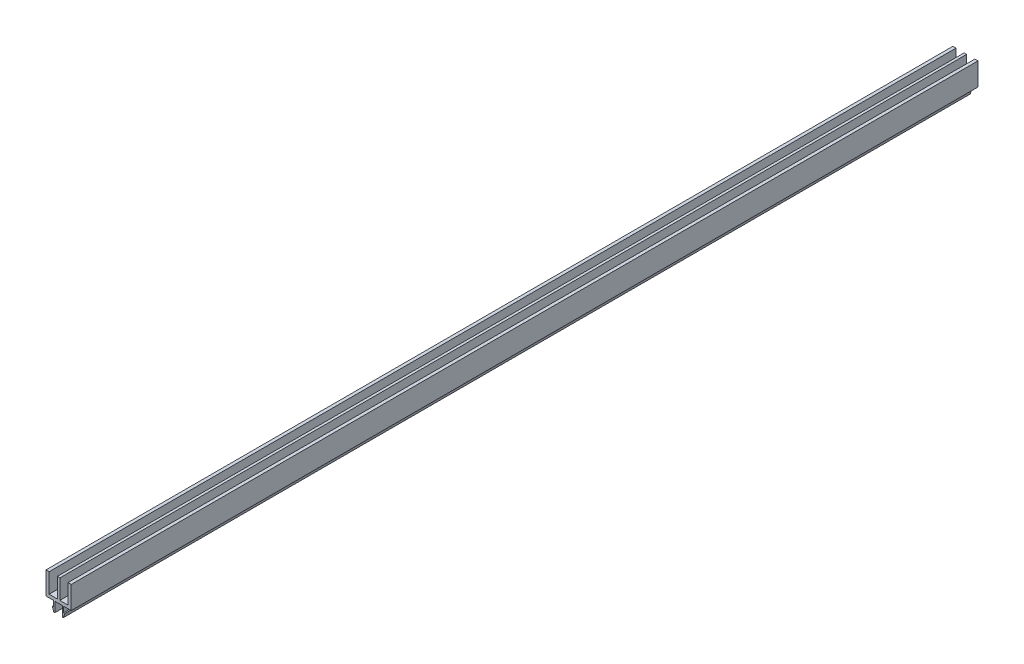
ISO-10303-21;
HEADER;
FILE_DESCRIPTION(('STEP AP214'),'2;1');
FILE_NAME('part.step','',(''),(''),'','','');
FILE_SCHEMA(('AUTOMOTIVE_DESIGN { 1 0 10303 214 1 1 1 1 }'));
ENDSEC;
DATA;
#1=APPLICATION_CONTEXT('core data for automotive mechanical design processes');
#2=APPLICATION_PROTOCOL_DEFINITION('international standard','automotive_design',2000,#1);
#3=PRODUCT_CONTEXT('',#1,'mechanical');
#4=PRODUCT('Part','Part','',(#3));
#5=PRODUCT_RELATED_PRODUCT_CATEGORY('part','',(#4));
#6=PRODUCT_DEFINITION_FORMATION('','',#4);
#7=PRODUCT_DEFINITION_CONTEXT('part definition',#1,'design');
#8=PRODUCT_DEFINITION('design','',#6,#7);
#9=PRODUCT_DEFINITION_SHAPE('','',#8);
#10=(LENGTH_UNIT() NAMED_UNIT(*) SI_UNIT(.MILLI.,.METRE.));
#11=(NAMED_UNIT(*) PLANE_ANGLE_UNIT() SI_UNIT($,.RADIAN.));
#12=(NAMED_UNIT(*) SI_UNIT($,.STERADIAN.) SOLID_ANGLE_UNIT());
#13=UNCERTAINTY_MEASURE_WITH_UNIT(LENGTH_MEASURE(1.E-05),#10,'distance_accuracy_value','');
#14=(GEOMETRIC_REPRESENTATION_CONTEXT(3) GLOBAL_UNCERTAINTY_ASSIGNED_CONTEXT((#13)) GLOBAL_UNIT_ASSIGNED_CONTEXT((#10,
#11,#12)) REPRESENTATION_CONTEXT('',''));
#15=CARTESIAN_POINT('',(0.,0.,0.));
#16=DIRECTION('',(0.,0.,1.));
#17=DIRECTION('',(1.,0.,0.));
#18=AXIS2_PLACEMENT_3D('',#15,#16,#17);
#19=CARTESIAN_POINT('',(-1.,17.9999999975,-670.));
#20=DIRECTION('',(-1.,0.,0.));
#21=DIRECTION('',(0.,-1.,0.));
#22=AXIS2_PLACEMENT_3D('',#19,#20,#21);
#23=PLANE('',#22);
#24=DIRECTION('',(0.,-1.,0.));
#25=VECTOR('',#24,1.);
#26=CARTESIAN_POINT('',(-1.,17.9999999975,50.));
#27=LINE('',#26,#25);
#28=CARTESIAN_POINT('',(-1.,17.9999999975,50.));
#29=VERTEX_POINT('',#28);
#30=CARTESIAN_POINT('',(-1.,2.4999999995,50.));
#31=VERTEX_POINT('',#30);
#32=EDGE_CURVE('E225',#29,#31,#27,.T.);
#33=ORIENTED_EDGE('',*,*,#32,.F.);
#34=DIRECTION('',(0.,0.,1.));
#35=VECTOR('',#34,1.);
#36=CARTESIAN_POINT('',(-1.,17.9999999975,-670.));
#37=LINE('',#36,#35);
#38=CARTESIAN_POINT('',(-1.,17.9999999975,-670.));
#39=VERTEX_POINT('',#38);
#40=EDGE_CURVE('E11',#39,#29,#37,.T.);
#41=ORIENTED_EDGE('',*,*,#40,.F.);
#42=DIRECTION('',(0.,-1.,0.));
#43=VECTOR('',#42,1.);
#44=CARTESIAN_POINT('',(-1.,17.9999999975,-670.));
#45=LINE('',#44,#43);
#46=CARTESIAN_POINT('',(-1.,2.4999999995,-670.));
#47=VERTEX_POINT('',#46);
#48=EDGE_CURVE('E293',#39,#47,#45,.T.);
#49=ORIENTED_EDGE('',*,*,#48,.T.);
#50=DIRECTION('',(0.,0.,1.));
#51=VECTOR('',#50,1.);
#52=CARTESIAN_POINT('',(-1.,2.4999999995,-670.));
#53=LINE('',#52,#51);
#54=EDGE_CURVE('E35',#47,#31,#53,.T.);
#55=ORIENTED_EDGE('',*,*,#54,.T.);
#56=EDGE_LOOP('',(#33,#41,#49,#55));
#57=FACE_BOUND('',#56,.T.);
#58=ADVANCED_FACE('F32',(#57),#23,.T.);
#59=CARTESIAN_POINT('',(0.999999999999998,17.9999999975,-670.));
#60=DIRECTION('',(0.,1.,0.));
#61=DIRECTION('',(0.,0.,1.));
#62=AXIS2_PLACEMENT_3D('',#59,#60,#61);
#63=PLANE('',#62);
#64=DIRECTION('',(-1.,0.,0.));
#65=VECTOR('',#64,1.);
#66=CARTESIAN_POINT('',(0.999999999999998,17.9999999975,50.));
#67=LINE('',#66,#65);
#68=CARTESIAN_POINT('',(0.999999999999998,17.9999999975,50.));
#69=VERTEX_POINT('',#68);
#70=EDGE_CURVE('E291',#69,#29,#67,.T.);
#71=ORIENTED_EDGE('',*,*,#70,.F.);
#72=DIRECTION('',(0.,0.,1.));
#73=VECTOR('',#72,1.);
#74=CARTESIAN_POINT('',(0.999999999999998,17.9999999975,-670.));
#75=LINE('',#74,#73);
#76=CARTESIAN_POINT('',(0.999999999999998,17.9999999975,-670.));
#77=VERTEX_POINT('',#76);
#78=EDGE_CURVE('E41',#77,#69,#75,.T.);
#79=ORIENTED_EDGE('',*,*,#78,.F.);
#80=DIRECTION('',(-1.,0.,0.));
#81=VECTOR('',#80,1.);
#82=CARTESIAN_POINT('',(0.999999999999998,17.9999999975,-670.));
#83=LINE('',#82,#81);
#84=EDGE_CURVE('E215',#77,#39,#83,.T.);
#85=ORIENTED_EDGE('',*,*,#84,.T.);
#86=ORIENTED_EDGE('',*,*,#40,.T.);
#87=EDGE_LOOP('',(#71,#79,#85,#86));
#88=FACE_BOUND('',#87,.T.);
#89=ADVANCED_FACE('F337',(#88),#63,.T.);
#90=CARTESIAN_POINT('',(0.999999999999998,2.4999999995,-670.));
#91=DIRECTION('',(1.,0.,0.));
#92=DIRECTION('',(0.,0.,-1.));
#93=AXIS2_PLACEMENT_3D('',#90,#91,#92);
#94=PLANE('',#93);
#95=DIRECTION('',(0.,1.,0.));
#96=VECTOR('',#95,1.);
#97=CARTESIAN_POINT('',(0.999999999999998,2.4999999995,50.));
#98=LINE('',#97,#96);
#99=CARTESIAN_POINT('',(0.999999999999998,2.4999999995,50.));
#100=VERTEX_POINT('',#99);
#101=EDGE_CURVE('E202',#100,#69,#98,.T.);
#102=ORIENTED_EDGE('',*,*,#101,.F.);
#103=DIRECTION('',(0.,0.,1.));
#104=VECTOR('',#103,1.);
#105=CARTESIAN_POINT('',(0.999999999999998,2.4999999995,-670.));
#106=LINE('',#105,#104);
#107=CARTESIAN_POINT('',(0.999999999999998,2.4999999995,-670.));
#108=VERTEX_POINT('',#107);
#109=EDGE_CURVE('E197',#108,#100,#106,.T.);
#110=ORIENTED_EDGE('',*,*,#109,.F.);
#111=DIRECTION('',(0.,1.,0.));
#112=VECTOR('',#111,1.);
#113=CARTESIAN_POINT('',(0.999999999999998,2.4999999995,-670.));
#114=LINE('',#113,#112);
#115=EDGE_CURVE('E200',#108,#77,#114,.T.);
#116=ORIENTED_EDGE('',*,*,#115,.T.);
#117=ORIENTED_EDGE('',*,*,#78,.T.);
#118=EDGE_LOOP('',(#102,#110,#116,#117));
#119=FACE_BOUND('',#118,.T.);
#120=ADVANCED_FACE('F199',(#119),#94,.T.);
#121=CARTESIAN_POINT('',(7.5,2.4999999995,-670.));
#122=DIRECTION('',(0.,1.,0.));
#123=DIRECTION('',(-1.,0.,0.));
#124=AXIS2_PLACEMENT_3D('',#121,#122,#123);
#125=PLANE('',#124);
#126=DIRECTION('',(-1.,0.,0.));
#127=VECTOR('',#126,1.);
#128=CARTESIAN_POINT('',(7.5,2.4999999995,50.));
#129=LINE('',#128,#127);
#130=CARTESIAN_POINT('',(7.5,2.4999999995,50.));
#131=VERTEX_POINT('',#130);
#132=EDGE_CURVE('E288',#131,#100,#129,.T.);
#133=ORIENTED_EDGE('',*,*,#132,.F.);
#134=DIRECTION('',(0.,0.,1.));
#135=VECTOR('',#134,1.);
#136=CARTESIAN_POINT('',(7.5,2.4999999995,-670.));
#137=LINE('',#136,#135);
#138=CARTESIAN_POINT('',(7.5,2.4999999995,-670.));
#139=VERTEX_POINT('',#138);
#140=EDGE_CURVE('E207',#139,#131,#137,.T.);
#141=ORIENTED_EDGE('',*,*,#140,.F.);
#142=DIRECTION('',(-1.,0.,0.));
#143=VECTOR('',#142,1.);
#144=CARTESIAN_POINT('',(7.5,2.4999999995,-670.));
#145=LINE('',#144,#143);
#146=EDGE_CURVE('E213',#139,#108,#145,.T.);
#147=ORIENTED_EDGE('',*,*,#146,.T.);
#148=ORIENTED_EDGE('',*,*,#109,.T.);
#149=EDGE_LOOP('',(#133,#141,#147,#148));
#150=FACE_BOUND('',#149,.T.);
#151=ADVANCED_FACE('F217',(#150),#125,.T.);
#152=CARTESIAN_POINT('',(7.5,17.9999999975,-670.));
#153=DIRECTION('',(-1.,0.,0.));
#154=DIRECTION('',(0.,-1.,0.));
#155=AXIS2_PLACEMENT_3D('',#152,#153,#154);
#156=PLANE('',#155);
#157=DIRECTION('',(0.,-1.,0.));
#158=VECTOR('',#157,1.);
#159=CARTESIAN_POINT('',(7.5,17.9999999975,50.));
#160=LINE('',#159,#158);
#161=CARTESIAN_POINT('',(7.5,17.9999999975,50.));
#162=VERTEX_POINT('',#161);
#163=EDGE_CURVE('E285',#162,#131,#160,.T.);
#164=ORIENTED_EDGE('',*,*,#163,.F.);
#165=DIRECTION('',(0.,0.,1.));
#166=VECTOR('',#165,1.);
#167=CARTESIAN_POINT('',(7.5,17.9999999975,-670.));
#168=LINE('',#167,#166);
#169=CARTESIAN_POINT('',(7.5,17.9999999975,-670.));
#170=VERTEX_POINT('',#169);
#171=EDGE_CURVE('E297',#170,#162,#168,.T.);
#172=ORIENTED_EDGE('',*,*,#171,.F.);
#173=DIRECTION('',(0.,-1.,0.));
#174=VECTOR('',#173,1.);
#175=CARTESIAN_POINT('',(7.5,17.9999999975,-670.));
#176=LINE('',#175,#174);
#177=EDGE_CURVE('E218',#170,#139,#176,.T.);
#178=ORIENTED_EDGE('',*,*,#177,.T.);
#179=ORIENTED_EDGE('',*,*,#140,.T.);
#180=EDGE_LOOP('',(#164,#172,#178,#179));
#181=FACE_BOUND('',#180,.T.);
#182=ADVANCED_FACE('F350',(#181),#156,.T.);
#183=CARTESIAN_POINT('',(10.,17.9999999975,-670.));
#184=DIRECTION('',(0.,1.,0.));
#185=DIRECTION('',(0.,0.,1.));
#186=AXIS2_PLACEMENT_3D('',#183,#184,#185);
#187=PLANE('',#186);
#188=DIRECTION('',(-1.,0.,0.));
#189=VECTOR('',#188,1.);
#190=CARTESIAN_POINT('',(10.,17.9999999975,50.));
#191=LINE('',#190,#189);
#192=CARTESIAN_POINT('',(10.,17.9999999975,50.));
#193=VERTEX_POINT('',#192);
#194=EDGE_CURVE('E282',#193,#162,#191,.T.);
#195=ORIENTED_EDGE('',*,*,#194,.F.);
#196=DIRECTION('',(0.,0.,1.));
#197=VECTOR('',#196,1.);
#198=CARTESIAN_POINT('',(10.,17.9999999975,-670.));
#199=LINE('',#198,#197);
#200=CARTESIAN_POINT('',(10.,17.9999999975,-670.));
#201=VERTEX_POINT('',#200);
#202=EDGE_CURVE('E299',#201,#193,#199,.T.);
#203=ORIENTED_EDGE('',*,*,#202,.F.);
#204=DIRECTION('',(-1.,0.,0.));
#205=VECTOR('',#204,1.);
#206=CARTESIAN_POINT('',(10.,17.9999999975,-670.));
#207=LINE('',#206,#205);
#208=EDGE_CURVE('E220',#201,#170,#207,.T.);
#209=ORIENTED_EDGE('',*,*,#208,.T.);
#210=ORIENTED_EDGE('',*,*,#171,.T.);
#211=EDGE_LOOP('',(#195,#203,#209,#210));
#212=FACE_BOUND('',#211,.T.);
#213=ADVANCED_FACE('F353',(#212),#187,.T.);
#214=CARTESIAN_POINT('',(10.,-4.99999828349541E-10,-670.));
#215=DIRECTION('',(1.,0.,0.));
#216=DIRECTION('',(0.,0.,-1.));
#217=AXIS2_PLACEMENT_3D('',#214,#215,#216);
#218=PLANE('',#217);
#219=DIRECTION('',(0.,1.,0.));
#220=VECTOR('',#219,1.);
#221=CARTESIAN_POINT('',(10.,-4.99999828349541E-10,50.));
#222=LINE('',#221,#220);
#223=CARTESIAN_POINT('',(10.,-4.99999828349541E-10,50.));
#224=VERTEX_POINT('',#223);
#225=EDGE_CURVE('E279',#224,#193,#222,.T.);
#226=ORIENTED_EDGE('',*,*,#225,.F.);
#227=DIRECTION('',(0.,0.,1.));
#228=VECTOR('',#227,1.);
#229=CARTESIAN_POINT('',(10.,-4.99999828349541E-10,-670.));
#230=LINE('',#229,#228);
#231=CARTESIAN_POINT('',(10.,-4.99999828349541E-10,-670.));
#232=VERTEX_POINT('',#231);
#233=EDGE_CURVE('E301',#232,#224,#230,.T.);
#234=ORIENTED_EDGE('',*,*,#233,.F.);
#235=DIRECTION('',(0.,1.,0.));
#236=VECTOR('',#235,1.);
#237=CARTESIAN_POINT('',(10.,-4.99999828349541E-10,-670.));
#238=LINE('',#237,#236);
#239=EDGE_CURVE('E643',#232,#201,#238,.T.);
#240=ORIENTED_EDGE('',*,*,#239,.T.);
#241=ORIENTED_EDGE('',*,*,#202,.T.);
#242=EDGE_LOOP('',(#226,#234,#240,#241));
#243=FACE_BOUND('',#242,.T.);
#244=ADVANCED_FACE('F357',(#243),#218,.T.);
#245=CARTESIAN_POINT('',(4.,-4.99999998002099E-10,-670.));
#246=DIRECTION('',(0.,-1.,0.));
#247=DIRECTION('',(1.,0.,0.));
#248=AXIS2_PLACEMENT_3D('',#245,#246,#247);
#249=PLANE('',#248);
#250=DIRECTION('',(1.,0.,0.));
#251=VECTOR('',#250,1.);
#252=CARTESIAN_POINT('',(4.,-4.99999998002099E-10,50.));
#253=LINE('',#252,#251);
#254=CARTESIAN_POINT('',(4.,-4.99999998002099E-10,50.));
#255=VERTEX_POINT('',#254);
#256=EDGE_CURVE('E276',#255,#224,#253,.T.);
#257=ORIENTED_EDGE('',*,*,#256,.F.);
#258=DIRECTION('',(0.,0.,1.));
#259=VECTOR('',#258,1.);
#260=CARTESIAN_POINT('',(4.,-4.99999998002099E-10,-670.));
#261=LINE('',#260,#259);
#262=CARTESIAN_POINT('',(4.,-4.99999998002099E-10,-670.));
#263=VERTEX_POINT('',#262);
#264=EDGE_CURVE('E303',#263,#255,#261,.T.);
#265=ORIENTED_EDGE('',*,*,#264,.F.);
#266=DIRECTION('',(1.,0.,0.));
#267=VECTOR('',#266,1.);
#268=CARTESIAN_POINT('',(4.,-4.99999998002099E-10,-670.));
#269=LINE('',#268,#267);
#270=EDGE_CURVE('E647',#263,#232,#269,.T.);
#271=ORIENTED_EDGE('',*,*,#270,.T.);
#272=ORIENTED_EDGE('',*,*,#233,.T.);
#273=EDGE_LOOP('',(#257,#265,#271,#272));
#274=FACE_BOUND('',#273,.T.);
#275=ADVANCED_FACE('F361',(#274),#249,.T.);
#276=CARTESIAN_POINT('',(4.,-4.5,-670.));
#277=DIRECTION('',(1.,0.,0.));
#278=DIRECTION('',(0.,0.,-1.));
#279=AXIS2_PLACEMENT_3D('',#276,#277,#278);
#280=PLANE('',#279);
#281=DIRECTION('',(0.,1.,0.));
#282=VECTOR('',#281,1.);
#283=CARTESIAN_POINT('',(4.,-4.5,50.));
#284=LINE('',#283,#282);
#285=CARTESIAN_POINT('',(4.,-4.5,50.));
#286=VERTEX_POINT('',#285);
#287=EDGE_CURVE('E273',#286,#255,#284,.T.);
#288=ORIENTED_EDGE('',*,*,#287,.F.);
#289=DIRECTION('',(0.,0.,1.));
#290=VECTOR('',#289,1.);
#291=CARTESIAN_POINT('',(4.,-4.5,-670.));
#292=LINE('',#291,#290);
#293=CARTESIAN_POINT('',(4.,-4.5,-670.));
#294=VERTEX_POINT('',#293);
#295=EDGE_CURVE('E305',#294,#286,#292,.T.);
#296=ORIENTED_EDGE('',*,*,#295,.F.);
#297=DIRECTION('',(0.,1.,0.));
#298=VECTOR('',#297,1.);
#299=CARTESIAN_POINT('',(4.,-4.5,-670.));
#300=LINE('',#299,#298);
#301=EDGE_CURVE('E636',#294,#263,#300,.T.);
#302=ORIENTED_EDGE('',*,*,#301,.T.);
#303=ORIENTED_EDGE('',*,*,#264,.T.);
#304=EDGE_LOOP('',(#288,#296,#302,#303));
#305=FACE_BOUND('',#304,.T.);
#306=ADVANCED_FACE('F365',(#305),#280,.T.);
#307=CARTESIAN_POINT('',(5.,-4.5,-670.));
#308=DIRECTION('',(0.,1.,0.));
#309=DIRECTION('',(0.,0.,1.));
#310=AXIS2_PLACEMENT_3D('',#307,#308,#309);
#311=PLANE('',#310);
#312=DIRECTION('',(-1.,0.,0.));
#313=VECTOR('',#312,1.);
#314=CARTESIAN_POINT('',(5.,-4.5,50.));
#315=LINE('',#314,#313);
#316=CARTESIAN_POINT('',(5.,-4.5,50.));
#317=VERTEX_POINT('',#316);
#318=EDGE_CURVE('E270',#317,#286,#315,.T.);
#319=ORIENTED_EDGE('',*,*,#318,.F.);
#320=DIRECTION('',(0.,0.,1.));
#321=VECTOR('',#320,1.);
#322=CARTESIAN_POINT('',(5.,-4.5,-670.));
#323=LINE('',#322,#321);
#324=CARTESIAN_POINT('',(5.,-4.5,-670.));
#325=VERTEX_POINT('',#324);
#326=EDGE_CURVE('E307',#325,#317,#323,.T.);
#327=ORIENTED_EDGE('',*,*,#326,.F.);
#328=DIRECTION('',(-1.,0.,0.));
#329=VECTOR('',#328,1.);
#330=CARTESIAN_POINT('',(5.,-4.5,-670.));
#331=LINE('',#330,#329);
#332=EDGE_CURVE('E632',#325,#294,#331,.T.);
#333=ORIENTED_EDGE('',*,*,#332,.T.);
#334=ORIENTED_EDGE('',*,*,#295,.T.);
#335=EDGE_LOOP('',(#319,#327,#333,#334));
#336=FACE_BOUND('',#335,.T.);
#337=ADVANCED_FACE('F369',(#336),#311,.T.);
#338=CARTESIAN_POINT('',(3.75,-8.,-670.));
#339=DIRECTION('',(0.941741911594837,-0.336336396998157,0.));
#340=DIRECTION('',(0.336336396998157,0.941741911594837,0.));
#341=AXIS2_PLACEMENT_3D('',#338,#339,#340);
#342=PLANE('',#341);
#343=DIRECTION('',(0.336336396998157,0.941741911594837,0.));
#344=VECTOR('',#343,1.);
#345=CARTESIAN_POINT('',(3.75,-8.,50.));
#346=LINE('',#345,#344);
#347=CARTESIAN_POINT('',(3.75,-8.,50.));
#348=VERTEX_POINT('',#347);
#349=EDGE_CURVE('E267',#348,#317,#346,.T.);
#350=ORIENTED_EDGE('',*,*,#349,.F.);
#351=DIRECTION('',(0.,0.,1.));
#352=VECTOR('',#351,1.);
#353=CARTESIAN_POINT('',(3.75,-8.,-670.));
#354=LINE('',#353,#352);
#355=CARTESIAN_POINT('',(3.75,-8.,-670.));
#356=VERTEX_POINT('',#355);
#357=EDGE_CURVE('E309',#356,#348,#354,.T.);
#358=ORIENTED_EDGE('',*,*,#357,.F.);
#359=DIRECTION('',(0.336336396998157,0.941741911594837,0.));
#360=VECTOR('',#359,1.);
#361=CARTESIAN_POINT('',(3.75,-8.,-670.));
#362=LINE('',#361,#360);
#363=EDGE_CURVE('E653',#356,#325,#362,.T.);
#364=ORIENTED_EDGE('',*,*,#363,.T.);
#365=ORIENTED_EDGE('',*,*,#326,.T.);
#366=EDGE_LOOP('',(#350,#358,#364,#365));
#367=FACE_BOUND('',#366,.T.);
#368=ADVANCED_FACE('F373',(#367),#342,.T.);
#369=CARTESIAN_POINT('',(3.,-8.,-670.));
#370=DIRECTION('',(0.,-1.,0.));
#371=DIRECTION('',(0.,0.,-1.));
#372=AXIS2_PLACEMENT_3D('',#369,#370,#371);
#373=PLANE('',#372);
#374=DIRECTION('',(1.,0.,0.));
#375=VECTOR('',#374,1.);
#376=CARTESIAN_POINT('',(3.,-8.,50.));
#377=LINE('',#376,#375);
#378=CARTESIAN_POINT('',(3.,-8.,50.));
#379=VERTEX_POINT('',#378);
#380=EDGE_CURVE('E264',#379,#348,#377,.T.);
#381=ORIENTED_EDGE('',*,*,#380,.F.);
#382=DIRECTION('',(0.,0.,1.));
#383=VECTOR('',#382,1.);
#384=CARTESIAN_POINT('',(3.,-8.,-670.));
#385=LINE('',#384,#383);
#386=CARTESIAN_POINT('',(3.,-8.,-670.));
#387=VERTEX_POINT('',#386);
#388=EDGE_CURVE('E311',#387,#379,#385,.T.);
#389=ORIENTED_EDGE('',*,*,#388,.F.);
#390=DIRECTION('',(1.,0.,0.));
#391=VECTOR('',#390,1.);
#392=CARTESIAN_POINT('',(3.,-8.,-670.));
#393=LINE('',#392,#391);
#394=EDGE_CURVE('E625',#387,#356,#393,.T.);
#395=ORIENTED_EDGE('',*,*,#394,.T.);
#396=ORIENTED_EDGE('',*,*,#357,.T.);
#397=EDGE_LOOP('',(#381,#389,#395,#396));
#398=FACE_BOUND('',#397,.T.);
#399=ADVANCED_FACE('F377',(#398),#373,.T.);
#400=CARTESIAN_POINT('',(3.,-4.9999985194348E-10,-670.));
#401=DIRECTION('',(-1.,0.,0.));
#402=DIRECTION('',(0.,0.,1.));
#403=AXIS2_PLACEMENT_3D('',#400,#401,#402);
#404=PLANE('',#403);
#405=DIRECTION('',(0.,-1.,0.));
#406=VECTOR('',#405,1.);
#407=CARTESIAN_POINT('',(3.,-4.9999985194348E-10,50.));
#408=LINE('',#407,#406);
#409=CARTESIAN_POINT('',(3.,-4.9999985194348E-10,50.));
#410=VERTEX_POINT('',#409);
#411=EDGE_CURVE('E261',#410,#379,#408,.T.);
#412=ORIENTED_EDGE('',*,*,#411,.F.);
#413=DIRECTION('',(0.,0.,1.));
#414=VECTOR('',#413,1.);
#415=CARTESIAN_POINT('',(3.,-4.9999985194348E-10,-670.));
#416=LINE('',#415,#414);
#417=CARTESIAN_POINT('',(3.,-4.9999985194348E-10,-670.));
#418=VERTEX_POINT('',#417);
#419=EDGE_CURVE('E313',#418,#410,#416,.T.);
#420=ORIENTED_EDGE('',*,*,#419,.F.);
#421=DIRECTION('',(0.,-1.,0.));
#422=VECTOR('',#421,1.);
#423=CARTESIAN_POINT('',(3.,-4.9999985194348E-10,-670.));
#424=LINE('',#423,#422);
#425=EDGE_CURVE('E621',#418,#387,#424,.T.);
#426=ORIENTED_EDGE('',*,*,#425,.T.);
#427=ORIENTED_EDGE('',*,*,#388,.T.);
#428=EDGE_LOOP('',(#412,#420,#426,#427));
#429=FACE_BOUND('',#428,.T.);
#430=ADVANCED_FACE('F381',(#429),#404,.T.);
#431=CARTESIAN_POINT('',(-3.,-4.99999455901012E-10,-670.));
#432=DIRECTION('',(0.,-1.,0.));
#433=DIRECTION('',(1.,0.,0.));
#434=AXIS2_PLACEMENT_3D('',#431,#432,#433);
#435=PLANE('',#434);
#436=DIRECTION('',(1.,0.,0.));
#437=VECTOR('',#436,1.);
#438=CARTESIAN_POINT('',(-3.,-4.99999455901012E-10,50.));
#439=LINE('',#438,#437);
#440=CARTESIAN_POINT('',(-3.,-4.99999455901012E-10,50.));
#441=VERTEX_POINT('',#440);
#442=EDGE_CURVE('E258',#441,#410,#439,.T.);
#443=ORIENTED_EDGE('',*,*,#442,.F.);
#444=DIRECTION('',(0.,0.,1.));
#445=VECTOR('',#444,1.);
#446=CARTESIAN_POINT('',(-3.,-4.99999455901012E-10,-670.));
#447=LINE('',#446,#445);
#448=CARTESIAN_POINT('',(-3.,-4.99999455901012E-10,-670.));
#449=VERTEX_POINT('',#448);
#450=EDGE_CURVE('E315',#449,#441,#447,.T.);
#451=ORIENTED_EDGE('',*,*,#450,.F.);
#452=DIRECTION('',(1.,0.,0.));
#453=VECTOR('',#452,1.);
#454=CARTESIAN_POINT('',(-3.,-4.99999455901012E-10,-670.));
#455=LINE('',#454,#453);
#456=EDGE_CURVE('E657',#449,#418,#455,.T.);
#457=ORIENTED_EDGE('',*,*,#456,.T.);
#458=ORIENTED_EDGE('',*,*,#419,.T.);
#459=EDGE_LOOP('',(#443,#451,#457,#458));
#460=FACE_BOUND('',#459,.T.);
#461=ADVANCED_FACE('F385',(#460),#435,.T.);
#462=CARTESIAN_POINT('',(-3.,-8.,-670.));
#463=DIRECTION('',(1.,0.,0.));
#464=DIRECTION('',(0.,0.,-1.));
#465=AXIS2_PLACEMENT_3D('',#462,#463,#464);
#466=PLANE('',#465);
#467=DIRECTION('',(0.,1.,0.));
#468=VECTOR('',#467,1.);
#469=CARTESIAN_POINT('',(-3.,-8.,50.));
#470=LINE('',#469,#468);
#471=CARTESIAN_POINT('',(-3.,-8.,50.));
#472=VERTEX_POINT('',#471);
#473=EDGE_CURVE('E255',#472,#441,#470,.T.);
#474=ORIENTED_EDGE('',*,*,#473,.F.);
#475=DIRECTION('',(0.,0.,1.));
#476=VECTOR('',#475,1.);
#477=CARTESIAN_POINT('',(-3.,-8.,-670.));
#478=LINE('',#477,#476);
#479=CARTESIAN_POINT('',(-3.,-8.,-670.));
#480=VERTEX_POINT('',#479);
#481=EDGE_CURVE('E317',#480,#472,#478,.T.);
#482=ORIENTED_EDGE('',*,*,#481,.F.);
#483=DIRECTION('',(0.,1.,0.));
#484=VECTOR('',#483,1.);
#485=CARTESIAN_POINT('',(-3.,-8.,-670.));
#486=LINE('',#485,#484);
#487=EDGE_CURVE('E614',#480,#449,#486,.T.);
#488=ORIENTED_EDGE('',*,*,#487,.T.);
#489=ORIENTED_EDGE('',*,*,#450,.T.);
#490=EDGE_LOOP('',(#474,#482,#488,#489));
#491=FACE_BOUND('',#490,.T.);
#492=ADVANCED_FACE('F389',(#491),#466,.T.);
#493=CARTESIAN_POINT('',(-3.75,-8.,-670.));
#494=DIRECTION('',(0.,-1.,0.));
#495=DIRECTION('',(0.,0.,-1.));
#496=AXIS2_PLACEMENT_3D('',#493,#494,#495);
#497=PLANE('',#496);
#498=DIRECTION('',(1.,0.,0.));
#499=VECTOR('',#498,1.);
#500=CARTESIAN_POINT('',(-3.75,-8.,50.));
#501=LINE('',#500,#499);
#502=CARTESIAN_POINT('',(-3.75,-8.,50.));
#503=VERTEX_POINT('',#502);
#504=EDGE_CURVE('E252',#503,#472,#501,.T.);
#505=ORIENTED_EDGE('',*,*,#504,.F.);
#506=DIRECTION('',(0.,0.,1.));
#507=VECTOR('',#506,1.);
#508=CARTESIAN_POINT('',(-3.75,-8.,-670.));
#509=LINE('',#508,#507);
#510=CARTESIAN_POINT('',(-3.75,-8.,-670.));
#511=VERTEX_POINT('',#510);
#512=EDGE_CURVE('E319',#511,#503,#509,.T.);
#513=ORIENTED_EDGE('',*,*,#512,.F.);
#514=DIRECTION('',(1.,0.,0.));
#515=VECTOR('',#514,1.);
#516=CARTESIAN_POINT('',(-3.75,-8.,-670.));
#517=LINE('',#516,#515);
#518=EDGE_CURVE('E610',#511,#480,#517,.T.);
#519=ORIENTED_EDGE('',*,*,#518,.T.);
#520=ORIENTED_EDGE('',*,*,#481,.T.);
#521=EDGE_LOOP('',(#505,#513,#519,#520));
#522=FACE_BOUND('',#521,.T.);
#523=ADVANCED_FACE('F393',(#522),#497,.T.);
#524=CARTESIAN_POINT('',(-5.,-4.5,-670.));
#525=DIRECTION('',(-0.941741911594837,-0.336336396998156,0.));
#526=DIRECTION('',(0.336336396998156,-0.941741911594838,0.));
#527=AXIS2_PLACEMENT_3D('',#524,#525,#526);
#528=PLANE('',#527);
#529=DIRECTION('',(0.336336396998156,-0.941741911594837,0.));
#530=VECTOR('',#529,1.);
#531=CARTESIAN_POINT('',(-5.,-4.5,50.));
#532=LINE('',#531,#530);
#533=CARTESIAN_POINT('',(-5.,-4.5,50.));
#534=VERTEX_POINT('',#533);
#535=EDGE_CURVE('E249',#534,#503,#532,.T.);
#536=ORIENTED_EDGE('',*,*,#535,.F.);
#537=DIRECTION('',(0.,0.,1.));
#538=VECTOR('',#537,1.);
#539=CARTESIAN_POINT('',(-5.,-4.5,-670.));
#540=LINE('',#539,#538);
#541=CARTESIAN_POINT('',(-5.,-4.5,-670.));
#542=VERTEX_POINT('',#541);
#543=EDGE_CURVE('E321',#542,#534,#540,.T.);
#544=ORIENTED_EDGE('',*,*,#543,.F.);
#545=DIRECTION('',(0.336336396998156,-0.941741911594837,0.));
#546=VECTOR('',#545,1.);
#547=CARTESIAN_POINT('',(-5.,-4.5,-670.));
#548=LINE('',#547,#546);
#549=EDGE_CURVE('E661',#542,#511,#548,.T.);
#550=ORIENTED_EDGE('',*,*,#549,.T.);
#551=ORIENTED_EDGE('',*,*,#512,.T.);
#552=EDGE_LOOP('',(#536,#544,#550,#551));
#553=FACE_BOUND('',#552,.T.);
#554=ADVANCED_FACE('F397',(#553),#528,.T.);
#555=CARTESIAN_POINT('',(-4.,-4.5,-670.));
#556=DIRECTION('',(0.,1.,0.));
#557=DIRECTION('',(0.,0.,1.));
#558=AXIS2_PLACEMENT_3D('',#555,#556,#557);
#559=PLANE('',#558);
#560=DIRECTION('',(-1.,0.,0.));
#561=VECTOR('',#560,1.);
#562=CARTESIAN_POINT('',(-4.,-4.5,50.));
#563=LINE('',#562,#561);
#564=CARTESIAN_POINT('',(-4.,-4.5,50.));
#565=VERTEX_POINT('',#564);
#566=EDGE_CURVE('E246',#565,#534,#563,.T.);
#567=ORIENTED_EDGE('',*,*,#566,.F.);
#568=DIRECTION('',(0.,0.,1.));
#569=VECTOR('',#568,1.);
#570=CARTESIAN_POINT('',(-4.,-4.5,-670.));
#571=LINE('',#570,#569);
#572=CARTESIAN_POINT('',(-4.,-4.5,-670.));
#573=VERTEX_POINT('',#572);
#574=EDGE_CURVE('E323',#573,#565,#571,.T.);
#575=ORIENTED_EDGE('',*,*,#574,.F.);
#576=DIRECTION('',(-1.,0.,0.));
#577=VECTOR('',#576,1.);
#578=CARTESIAN_POINT('',(-4.,-4.5,-670.));
#579=LINE('',#578,#577);
#580=EDGE_CURVE('E603',#573,#542,#579,.T.);
#581=ORIENTED_EDGE('',*,*,#580,.T.);
#582=ORIENTED_EDGE('',*,*,#543,.T.);
#583=EDGE_LOOP('',(#567,#575,#581,#582));
#584=FACE_BOUND('',#583,.T.);
#585=ADVANCED_FACE('F401',(#584),#559,.T.);
#586=CARTESIAN_POINT('',(-4.,-4.9999985194348E-10,-670.));
#587=DIRECTION('',(-1.,0.,0.));
#588=DIRECTION('',(0.,0.,1.));
#589=AXIS2_PLACEMENT_3D('',#586,#587,#588);
#590=PLANE('',#589);
#591=DIRECTION('',(0.,-1.,0.));
#592=VECTOR('',#591,1.);
#593=CARTESIAN_POINT('',(-4.,-4.9999985194348E-10,50.));
#594=LINE('',#593,#592);
#595=CARTESIAN_POINT('',(-4.,-4.9999985194348E-10,50.));
#596=VERTEX_POINT('',#595);
#597=EDGE_CURVE('E243',#596,#565,#594,.T.);
#598=ORIENTED_EDGE('',*,*,#597,.F.);
#599=DIRECTION('',(0.,0.,1.));
#600=VECTOR('',#599,1.);
#601=CARTESIAN_POINT('',(-4.,-4.9999985194348E-10,-670.));
#602=LINE('',#601,#600);
#603=CARTESIAN_POINT('',(-4.,-4.9999985194348E-10,-670.));
#604=VERTEX_POINT('',#603);
#605=EDGE_CURVE('E325',#604,#596,#602,.T.);
#606=ORIENTED_EDGE('',*,*,#605,.F.);
#607=DIRECTION('',(0.,-1.,0.));
#608=VECTOR('',#607,1.);
#609=CARTESIAN_POINT('',(-4.,-4.9999985194348E-10,-670.));
#610=LINE('',#609,#608);
#611=EDGE_CURVE('E599',#604,#573,#610,.T.);
#612=ORIENTED_EDGE('',*,*,#611,.T.);
#613=ORIENTED_EDGE('',*,*,#574,.T.);
#614=EDGE_LOOP('',(#598,#606,#612,#613));
#615=FACE_BOUND('',#614,.T.);
#616=ADVANCED_FACE('F405',(#615),#590,.T.);
#617=CARTESIAN_POINT('',(-10.,-4.99999719929324E-10,-670.));
#618=DIRECTION('',(0.,-1.,0.));
#619=DIRECTION('',(1.,0.,0.));
#620=AXIS2_PLACEMENT_3D('',#617,#618,#619);
#621=PLANE('',#620);
#622=DIRECTION('',(1.,0.,0.));
#623=VECTOR('',#622,1.);
#624=CARTESIAN_POINT('',(-10.,-4.99999719929324E-10,50.));
#625=LINE('',#624,#623);
#626=CARTESIAN_POINT('',(-10.,-4.99999719929324E-10,50.));
#627=VERTEX_POINT('',#626);
#628=EDGE_CURVE('E240',#627,#596,#625,.T.);
#629=ORIENTED_EDGE('',*,*,#628,.F.);
#630=DIRECTION('',(0.,0.,1.));
#631=VECTOR('',#630,1.);
#632=CARTESIAN_POINT('',(-10.,-4.99999719929324E-10,-670.));
#633=LINE('',#632,#631);
#634=CARTESIAN_POINT('',(-10.,-4.99999719929324E-10,-670.));
#635=VERTEX_POINT('',#634);
#636=EDGE_CURVE('E327',#635,#627,#633,.T.);
#637=ORIENTED_EDGE('',*,*,#636,.F.);
#638=DIRECTION('',(1.,0.,0.));
#639=VECTOR('',#638,1.);
#640=CARTESIAN_POINT('',(-10.,-4.99999719929324E-10,-670.));
#641=LINE('',#640,#639);
#642=EDGE_CURVE('E665',#635,#604,#641,.T.);
#643=ORIENTED_EDGE('',*,*,#642,.T.);
#644=ORIENTED_EDGE('',*,*,#605,.T.);
#645=EDGE_LOOP('',(#629,#637,#643,#644));
#646=FACE_BOUND('',#645,.T.);
#647=ADVANCED_FACE('F409',(#646),#621,.T.);
#648=CARTESIAN_POINT('',(-10.,17.9999999975,-670.));
#649=DIRECTION('',(-1.,0.,0.));
#650=DIRECTION('',(0.,-1.,0.));
#651=AXIS2_PLACEMENT_3D('',#648,#649,#650);
#652=PLANE('',#651);
#653=DIRECTION('',(0.,-1.,0.));
#654=VECTOR('',#653,1.);
#655=CARTESIAN_POINT('',(-10.,17.9999999975,50.));
#656=LINE('',#655,#654);
#657=CARTESIAN_POINT('',(-10.,17.9999999975,50.));
#658=VERTEX_POINT('',#657);
#659=EDGE_CURVE('E237',#658,#627,#656,.T.);
#660=ORIENTED_EDGE('',*,*,#659,.F.);
#661=DIRECTION('',(0.,0.,1.));
#662=VECTOR('',#661,1.);
#663=CARTESIAN_POINT('',(-10.,17.9999999975,-670.));
#664=LINE('',#663,#662);
#665=CARTESIAN_POINT('',(-10.,17.9999999975,-670.));
#666=VERTEX_POINT('',#665);
#667=EDGE_CURVE('E329',#666,#658,#664,.T.);
#668=ORIENTED_EDGE('',*,*,#667,.F.);
#669=DIRECTION('',(0.,-1.,0.));
#670=VECTOR('',#669,1.);
#671=CARTESIAN_POINT('',(-10.,17.9999999975,-670.));
#672=LINE('',#671,#670);
#673=EDGE_CURVE('E592',#666,#635,#672,.T.);
#674=ORIENTED_EDGE('',*,*,#673,.T.);
#675=ORIENTED_EDGE('',*,*,#636,.T.);
#676=EDGE_LOOP('',(#660,#668,#674,#675));
#677=FACE_BOUND('',#676,.T.);
#678=ADVANCED_FACE('F413',(#677),#652,.T.);
#679=CARTESIAN_POINT('',(-7.5,17.9999999975,-670.));
#680=DIRECTION('',(0.,1.,0.));
#681=DIRECTION('',(0.,0.,1.));
#682=AXIS2_PLACEMENT_3D('',#679,#680,#681);
#683=PLANE('',#682);
#684=DIRECTION('',(-1.,0.,0.));
#685=VECTOR('',#684,1.);
#686=CARTESIAN_POINT('',(-7.5,17.9999999975,50.));
#687=LINE('',#686,#685);
#688=CARTESIAN_POINT('',(-7.5,17.9999999975,50.));
#689=VERTEX_POINT('',#688);
#690=EDGE_CURVE('E234',#689,#658,#687,.T.);
#691=ORIENTED_EDGE('',*,*,#690,.F.);
#692=DIRECTION('',(0.,0.,1.));
#693=VECTOR('',#692,1.);
#694=CARTESIAN_POINT('',(-7.5,17.9999999975,-670.));
#695=LINE('',#694,#693);
#696=CARTESIAN_POINT('',(-7.5,17.9999999975,-670.));
#697=VERTEX_POINT('',#696);
#698=EDGE_CURVE('E331',#697,#689,#695,.T.);
#699=ORIENTED_EDGE('',*,*,#698,.F.);
#700=DIRECTION('',(-1.,0.,0.));
#701=VECTOR('',#700,1.);
#702=CARTESIAN_POINT('',(-7.5,17.9999999975,-670.));
#703=LINE('',#702,#701);
#704=EDGE_CURVE('E588',#697,#666,#703,.T.);
#705=ORIENTED_EDGE('',*,*,#704,.T.);
#706=ORIENTED_EDGE('',*,*,#667,.T.);
#707=EDGE_LOOP('',(#691,#699,#705,#706));
#708=FACE_BOUND('',#707,.T.);
#709=ADVANCED_FACE('F417',(#708),#683,.T.);
#710=CARTESIAN_POINT('',(-7.5,2.4999999995,-670.));
#711=DIRECTION('',(1.,0.,0.));
#712=DIRECTION('',(0.,0.,-1.));
#713=AXIS2_PLACEMENT_3D('',#710,#711,#712);
#714=PLANE('',#713);
#715=DIRECTION('',(0.,1.,0.));
#716=VECTOR('',#715,1.);
#717=CARTESIAN_POINT('',(-7.5,2.4999999995,50.));
#718=LINE('',#717,#716);
#719=CARTESIAN_POINT('',(-7.5,2.4999999995,50.));
#720=VERTEX_POINT('',#719);
#721=EDGE_CURVE('E231',#720,#689,#718,.T.);
#722=ORIENTED_EDGE('',*,*,#721,.F.);
#723=DIRECTION('',(0.,0.,1.));
#724=VECTOR('',#723,1.);
#725=CARTESIAN_POINT('',(-7.5,2.4999999995,-670.));
#726=LINE('',#725,#724);
#727=CARTESIAN_POINT('',(-7.5,2.4999999995,-670.));
#728=VERTEX_POINT('',#727);
#729=EDGE_CURVE('E332',#728,#720,#726,.T.);
#730=ORIENTED_EDGE('',*,*,#729,.F.);
#731=DIRECTION('',(0.,1.,0.));
#732=VECTOR('',#731,1.);
#733=CARTESIAN_POINT('',(-7.5,2.4999999995,-670.));
#734=LINE('',#733,#732);
#735=EDGE_CURVE('E669',#728,#697,#734,.T.);
#736=ORIENTED_EDGE('',*,*,#735,.T.);
#737=ORIENTED_EDGE('',*,*,#698,.T.);
#738=EDGE_LOOP('',(#722,#730,#736,#737));
#739=FACE_BOUND('',#738,.T.);
#740=ADVANCED_FACE('F421',(#739),#714,.T.);
#741=CARTESIAN_POINT('',(-1.,2.4999999995,-670.));
#742=DIRECTION('',(0.,1.,0.));
#743=DIRECTION('',(-1.,0.,0.));
#744=AXIS2_PLACEMENT_3D('',#741,#742,#743);
#745=PLANE('',#744);
#746=DIRECTION('',(-1.,0.,0.));
#747=VECTOR('',#746,1.);
#748=CARTESIAN_POINT('',(-1.,2.4999999995,50.));
#749=LINE('',#748,#747);
#750=EDGE_CURVE('E228',#31,#720,#749,.T.);
#751=ORIENTED_EDGE('',*,*,#750,.F.);
#752=ORIENTED_EDGE('',*,*,#54,.F.);
#753=DIRECTION('',(-1.,0.,0.));
#754=VECTOR('',#753,1.);
#755=CARTESIAN_POINT('',(-1.,2.4999999995,-670.));
#756=LINE('',#755,#754);
#757=EDGE_CURVE('E671',#47,#728,#756,.T.);
#758=ORIENTED_EDGE('',*,*,#757,.T.);
#759=ORIENTED_EDGE('',*,*,#729,.T.);
#760=EDGE_LOOP('',(#751,#752,#758,#759));
#761=FACE_BOUND('',#760,.T.);
#762=ADVANCED_FACE('F334',(#761),#745,.T.);
#763=CARTESIAN_POINT('',(0.,0.,-670.));
#764=DIRECTION('',(0.,0.,-1.));
#765=DIRECTION('',(-1.,0.,0.));
#766=AXIS2_PLACEMENT_3D('',#763,#764,#765);
#767=PLANE('',#766);
#768=ORIENTED_EDGE('',*,*,#48,.F.);
#769=ORIENTED_EDGE('',*,*,#84,.F.);
#770=ORIENTED_EDGE('',*,*,#115,.F.);
#771=ORIENTED_EDGE('',*,*,#146,.F.);
#772=ORIENTED_EDGE('',*,*,#177,.F.);
#773=ORIENTED_EDGE('',*,*,#208,.F.);
#774=ORIENTED_EDGE('',*,*,#239,.F.);
#775=ORIENTED_EDGE('',*,*,#270,.F.);
#776=ORIENTED_EDGE('',*,*,#301,.F.);
#777=ORIENTED_EDGE('',*,*,#332,.F.);
#778=ORIENTED_EDGE('',*,*,#363,.F.);
#779=ORIENTED_EDGE('',*,*,#394,.F.);
#780=ORIENTED_EDGE('',*,*,#425,.F.);
#781=ORIENTED_EDGE('',*,*,#456,.F.);
#782=ORIENTED_EDGE('',*,*,#487,.F.);
#783=ORIENTED_EDGE('',*,*,#518,.F.);
#784=ORIENTED_EDGE('',*,*,#549,.F.);
#785=ORIENTED_EDGE('',*,*,#580,.F.);
#786=ORIENTED_EDGE('',*,*,#611,.F.);
#787=ORIENTED_EDGE('',*,*,#642,.F.);
#788=ORIENTED_EDGE('',*,*,#673,.F.);
#789=ORIENTED_EDGE('',*,*,#704,.F.);
#790=ORIENTED_EDGE('',*,*,#735,.F.);
#791=ORIENTED_EDGE('',*,*,#757,.F.);
#792=EDGE_LOOP('',(#768,#769,#770,#771,#772,#773,#774,#775,#776,#777,#778,#779,#780,#781,#782,
#783,#784,#785,#786,#787,#788,#789,#790,#791));
#793=FACE_BOUND('',#792,.T.);
#794=ADVANCED_FACE('F211',(#793),#767,.T.);
#795=CARTESIAN_POINT('',(0.,0.,50.));
#796=DIRECTION('',(0.,0.,-1.));
#797=DIRECTION('',(-1.,0.,0.));
#798=AXIS2_PLACEMENT_3D('',#795,#796,#797);
#799=PLANE('',#798);
#800=ORIENTED_EDGE('',*,*,#32,.T.);
#801=ORIENTED_EDGE('',*,*,#750,.T.);
#802=ORIENTED_EDGE('',*,*,#721,.T.);
#803=ORIENTED_EDGE('',*,*,#690,.T.);
#804=ORIENTED_EDGE('',*,*,#659,.T.);
#805=ORIENTED_EDGE('',*,*,#628,.T.);
#806=ORIENTED_EDGE('',*,*,#597,.T.);
#807=ORIENTED_EDGE('',*,*,#566,.T.);
#808=ORIENTED_EDGE('',*,*,#535,.T.);
#809=ORIENTED_EDGE('',*,*,#504,.T.);
#810=ORIENTED_EDGE('',*,*,#473,.T.);
#811=ORIENTED_EDGE('',*,*,#442,.T.);
#812=ORIENTED_EDGE('',*,*,#411,.T.);
#813=ORIENTED_EDGE('',*,*,#380,.T.);
#814=ORIENTED_EDGE('',*,*,#349,.T.);
#815=ORIENTED_EDGE('',*,*,#318,.T.);
#816=ORIENTED_EDGE('',*,*,#287,.T.);
#817=ORIENTED_EDGE('',*,*,#256,.T.);
#818=ORIENTED_EDGE('',*,*,#225,.T.);
#819=ORIENTED_EDGE('',*,*,#194,.T.);
#820=ORIENTED_EDGE('',*,*,#163,.T.);
#821=ORIENTED_EDGE('',*,*,#132,.T.);
#822=ORIENTED_EDGE('',*,*,#101,.T.);
#823=ORIENTED_EDGE('',*,*,#70,.T.);
#824=EDGE_LOOP('',(#800,#801,#802,#803,#804,#805,#806,#807,#808,#809,#810,#811,#812,#813,#814,
#815,#816,#817,#818,#819,#820,#821,#822,#823));
#825=FACE_BOUND('',#824,.T.);
#826=ADVANCED_FACE('F336',(#825),#799,.F.);
#827=CLOSED_SHELL('',(#58,#89,#120,#151,#182,#213,#244,#275,#306,#337,#368,#399,#430,#461,#492,
#523,#554,#585,#616,#647,#678,#709,#740,#762,#794,#826));
#828=MANIFOLD_SOLID_BREP('B2',#827);
#829=ADVANCED_BREP_SHAPE_REPRESENTATION('',(#18,#828),#14);
#830=SHAPE_DEFINITION_REPRESENTATION(#9,#829);
ENDSEC;
END-ISO-10303-21;
